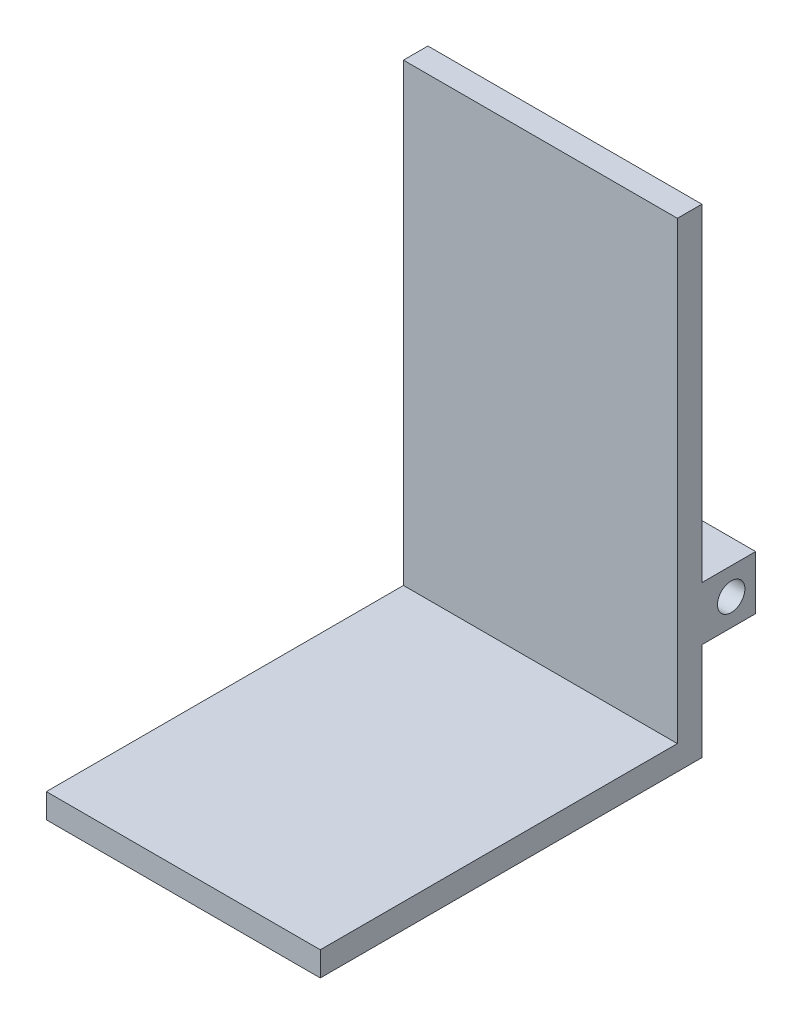
ISO-10303-21;
HEADER;
FILE_DESCRIPTION(('STEP AP214'),'2;1');
FILE_NAME('part.step','',(''),(''),'','','');
FILE_SCHEMA(('AUTOMOTIVE_DESIGN { 1 0 10303 214 1 1 1 1 }'));
ENDSEC;
DATA;
#1=APPLICATION_CONTEXT('core data for automotive mechanical design processes');
#2=APPLICATION_PROTOCOL_DEFINITION('international standard','automotive_design',2000,#1);
#3=PRODUCT_CONTEXT('',#1,'mechanical');
#4=PRODUCT('Part','Part','',(#3));
#5=PRODUCT_RELATED_PRODUCT_CATEGORY('part','',(#4));
#6=PRODUCT_DEFINITION_FORMATION('','',#4);
#7=PRODUCT_DEFINITION_CONTEXT('part definition',#1,'design');
#8=PRODUCT_DEFINITION('design','',#6,#7);
#9=PRODUCT_DEFINITION_SHAPE('','',#8);
#10=(LENGTH_UNIT() NAMED_UNIT(*) SI_UNIT(.MILLI.,.METRE.));
#11=(NAMED_UNIT(*) PLANE_ANGLE_UNIT() SI_UNIT($,.RADIAN.));
#12=(NAMED_UNIT(*) SI_UNIT($,.STERADIAN.) SOLID_ANGLE_UNIT());
#13=UNCERTAINTY_MEASURE_WITH_UNIT(LENGTH_MEASURE(1.E-05),#10,'distance_accuracy_value','');
#14=(GEOMETRIC_REPRESENTATION_CONTEXT(3) GLOBAL_UNCERTAINTY_ASSIGNED_CONTEXT((#13)) GLOBAL_UNIT_ASSIGNED_CONTEXT((#10,
#11,#12)) REPRESENTATION_CONTEXT('',''));
#15=CARTESIAN_POINT('',(0.,0.,0.));
#16=DIRECTION('',(0.,0.,1.));
#17=DIRECTION('',(1.,0.,0.));
#18=AXIS2_PLACEMENT_3D('',#15,#16,#17);
#19=CARTESIAN_POINT('',(-14.,2.5,-19.5));
#20=DIRECTION('',(0.,0.,1.));
#21=DIRECTION('',(1.,0.,0.));
#22=AXIS2_PLACEMENT_3D('',#19,#20,#21);
#23=PLANE('',#22);
#24=DIRECTION('',(1.,0.,0.));
#25=VECTOR('',#24,1.);
#26=CARTESIAN_POINT('',(-21.778174593052,15.5,-19.5));
#27=LINE('',#26,#25);
#28=CARTESIAN_POINT('',(-14.,15.5,-19.5));
#29=VERTEX_POINT('',#28);
#30=CARTESIAN_POINT('',(14.,15.5,-19.5));
#31=VERTEX_POINT('',#30);
#32=EDGE_CURVE('E194',#29,#31,#27,.T.);
#33=ORIENTED_EDGE('',*,*,#32,.F.);
#34=DIRECTION('',(0.,-1.,0.));
#35=VECTOR('',#34,1.);
#36=CARTESIAN_POINT('',(-14.,2.5,-19.5));
#37=LINE('',#36,#35);
#38=CARTESIAN_POINT('',(-14.,49.,-19.5));
#39=VERTEX_POINT('',#38);
#40=EDGE_CURVE('E179',#39,#29,#37,.T.);
#41=ORIENTED_EDGE('',*,*,#40,.F.);
#42=DIRECTION('',(-1.,0.,0.));
#43=VECTOR('',#42,1.);
#44=CARTESIAN_POINT('',(-14.,49.,-19.5));
#45=LINE('',#44,#43);
#46=CARTESIAN_POINT('',(14.,49.,-19.5));
#47=VERTEX_POINT('',#46);
#48=EDGE_CURVE('E155',#47,#39,#45,.T.);
#49=ORIENTED_EDGE('',*,*,#48,.F.);
#50=DIRECTION('',(0.,-1.,0.));
#51=VECTOR('',#50,1.);
#52=CARTESIAN_POINT('',(14.,2.5,-19.5));
#53=LINE('',#52,#51);
#54=EDGE_CURVE('E11',#47,#31,#53,.T.);
#55=ORIENTED_EDGE('',*,*,#54,.T.);
#56=EDGE_LOOP('',(#33,#41,#49,#55));
#57=FACE_BOUND('',#56,.T.);
#58=ADVANCED_FACE('F33',(#57),#23,.F.);
#59=CARTESIAN_POINT('',(0.,2.5,0.));
#60=DIRECTION('',(0.,-1.,0.));
#61=DIRECTION('',(0.,0.,-1.));
#62=AXIS2_PLACEMENT_3D('',#59,#60,#61);
#63=PLANE('',#62);
#64=DIRECTION('',(1.,0.,0.));
#65=VECTOR('',#64,1.);
#66=CARTESIAN_POINT('',(-14.,2.5,-17.));
#67=LINE('',#66,#65);
#68=CARTESIAN_POINT('',(-14.,2.5,-17.));
#69=VERTEX_POINT('',#68);
#70=CARTESIAN_POINT('',(14.,2.5,-17.));
#71=VERTEX_POINT('',#70);
#72=EDGE_CURVE('E146',#69,#71,#67,.T.);
#73=ORIENTED_EDGE('',*,*,#72,.F.);
#74=DIRECTION('',(0.,0.,1.));
#75=VECTOR('',#74,1.);
#76=CARTESIAN_POINT('',(-14.,2.5,19.5));
#77=LINE('',#76,#75);
#78=CARTESIAN_POINT('',(-14.,2.5,19.5));
#79=VERTEX_POINT('',#78);
#80=EDGE_CURVE('E167',#69,#79,#77,.T.);
#81=ORIENTED_EDGE('',*,*,#80,.T.);
#82=DIRECTION('',(1.,0.,0.));
#83=VECTOR('',#82,1.);
#84=CARTESIAN_POINT('',(-14.,2.5,19.5));
#85=LINE('',#84,#83);
#86=CARTESIAN_POINT('',(14.,2.5,19.5));
#87=VERTEX_POINT('',#86);
#88=EDGE_CURVE('E229',#79,#87,#85,.T.);
#89=ORIENTED_EDGE('',*,*,#88,.T.);
#90=DIRECTION('',(0.,0.,-1.));
#91=VECTOR('',#90,1.);
#92=CARTESIAN_POINT('',(14.,2.5,19.5));
#93=LINE('',#92,#91);
#94=EDGE_CURVE('E190',#87,#71,#93,.T.);
#95=ORIENTED_EDGE('',*,*,#94,.T.);
#96=EDGE_LOOP('',(#73,#81,#89,#95));
#97=FACE_BOUND('',#96,.T.);
#98=ADVANCED_FACE('F237',(#97),#63,.F.);
#99=CARTESIAN_POINT('',(14.,2.5,19.5));
#100=DIRECTION('',(-1.,0.,0.));
#101=DIRECTION('',(0.,0.,1.));
#102=AXIS2_PLACEMENT_3D('',#99,#100,#101);
#103=PLANE('',#102);
#104=DIRECTION('',(0.,0.,-1.));
#105=VECTOR('',#104,1.);
#106=CARTESIAN_POINT('',(14.,0.,19.5));
#107=LINE('',#106,#105);
#108=CARTESIAN_POINT('',(14.,0.,19.5));
#109=VERTEX_POINT('',#108);
#110=CARTESIAN_POINT('',(14.,0.,-19.5));
#111=VERTEX_POINT('',#110);
#112=EDGE_CURVE('E176',#109,#111,#107,.T.);
#113=ORIENTED_EDGE('',*,*,#112,.T.);
#114=CARTESIAN_POINT('',(14.,10.,-19.5));
#115=VERTEX_POINT('',#114);
#116=EDGE_CURVE('E42',#115,#111,#53,.T.);
#117=ORIENTED_EDGE('',*,*,#116,.F.);
#118=DIRECTION('',(0.,0.,-1.));
#119=VECTOR('',#118,1.);
#120=CARTESIAN_POINT('',(14.,10.,-19.5));
#121=LINE('',#120,#119);
#122=CARTESIAN_POINT('',(14.,10.,-25.));
#123=VERTEX_POINT('',#122);
#124=EDGE_CURVE('E115',#115,#123,#121,.T.);
#125=ORIENTED_EDGE('',*,*,#124,.T.);
#126=DIRECTION('',(0.,1.,0.));
#127=VECTOR('',#126,1.);
#128=CARTESIAN_POINT('',(14.,15.5,-25.));
#129=LINE('',#128,#127);
#130=CARTESIAN_POINT('',(14.,15.5,-25.));
#131=VERTEX_POINT('',#130);
#132=EDGE_CURVE('E122',#123,#131,#129,.T.);
#133=ORIENTED_EDGE('',*,*,#132,.T.);
#134=DIRECTION('',(0.,0.,1.));
#135=VECTOR('',#134,1.);
#136=CARTESIAN_POINT('',(14.,15.5,-19.5));
#137=LINE('',#136,#135);
#138=EDGE_CURVE('E128',#131,#31,#137,.T.);
#139=ORIENTED_EDGE('',*,*,#138,.T.);
#140=ORIENTED_EDGE('',*,*,#54,.F.);
#141=DIRECTION('',(0.,0.,-1.));
#142=VECTOR('',#141,1.);
#143=CARTESIAN_POINT('',(14.,49.,-19.5));
#144=LINE('',#143,#142);
#145=CARTESIAN_POINT('',(14.,49.,-17.));
#146=VERTEX_POINT('',#145);
#147=EDGE_CURVE('E152',#146,#47,#144,.T.);
#148=ORIENTED_EDGE('',*,*,#147,.F.);
#149=DIRECTION('',(0.,-1.,0.));
#150=VECTOR('',#149,1.);
#151=CARTESIAN_POINT('',(14.,49.,-17.));
#152=LINE('',#151,#150);
#153=EDGE_CURVE('E158',#146,#71,#152,.T.);
#154=ORIENTED_EDGE('',*,*,#153,.T.);
#155=ORIENTED_EDGE('',*,*,#94,.F.);
#156=DIRECTION('',(0.,-1.,0.));
#157=VECTOR('',#156,1.);
#158=CARTESIAN_POINT('',(14.,2.5,19.5));
#159=LINE('',#158,#157);
#160=EDGE_CURVE('E227',#87,#109,#159,.T.);
#161=ORIENTED_EDGE('',*,*,#160,.T.);
#162=EDGE_LOOP('',(#113,#117,#125,#133,#139,#140,#148,#154,#155,#161));
#163=FACE_BOUND('',#162,.T.);
#164=CARTESIAN_POINT('',(14.,12.75,-22.5));
#165=DIRECTION('',(1.,0.,0.));
#166=DIRECTION('',(0.,0.,-1.));
#167=AXIS2_PLACEMENT_3D('',#164,#165,#166);
#168=CIRCLE('',#167,1.4);
#169=CARTESIAN_POINT('',(14.,12.75,-23.9));
#170=VERTEX_POINT('',#169);
#171=EDGE_CURVE('E132',#170,#170,#168,.T.);
#172=ORIENTED_EDGE('',*,*,#171,.F.);
#173=EDGE_LOOP('',(#172));
#174=FACE_BOUND('',#173,.T.);
#175=ADVANCED_FACE('F35',(#163,#174),#103,.F.);
#176=CARTESIAN_POINT('',(-14.,10.,-19.5));
#177=VERTEX_POINT('',#176);
#178=CARTESIAN_POINT('',(-14.,0.,-19.5));
#179=VERTEX_POINT('',#178);
#180=EDGE_CURVE('E55',#177,#179,#37,.T.);
#181=ORIENTED_EDGE('',*,*,#180,.F.);
#182=DIRECTION('',(1.,0.,0.));
#183=VECTOR('',#182,1.);
#184=CARTESIAN_POINT('',(-21.778174593052,10.,-19.5));
#185=LINE('',#184,#183);
#186=EDGE_CURVE('E50',#177,#115,#185,.T.);
#187=ORIENTED_EDGE('',*,*,#186,.T.);
#188=ORIENTED_EDGE('',*,*,#116,.T.);
#189=DIRECTION('',(-1.,0.,0.));
#190=VECTOR('',#189,1.);
#191=CARTESIAN_POINT('',(-14.,0.,-19.5));
#192=LINE('',#191,#190);
#193=EDGE_CURVE('E216',#111,#179,#192,.T.);
#194=ORIENTED_EDGE('',*,*,#193,.T.);
#195=EDGE_LOOP('',(#181,#187,#188,#194));
#196=FACE_BOUND('',#195,.T.);
#197=ADVANCED_FACE('F217',(#196),#23,.F.);
#198=CARTESIAN_POINT('',(-14.,2.5,19.5));
#199=DIRECTION('',(1.,0.,0.));
#200=DIRECTION('',(0.,0.,-1.));
#201=AXIS2_PLACEMENT_3D('',#198,#199,#200);
#202=PLANE('',#201);
#203=DIRECTION('',(0.,0.,1.));
#204=VECTOR('',#203,1.);
#205=CARTESIAN_POINT('',(-14.,0.,19.5));
#206=LINE('',#205,#204);
#207=CARTESIAN_POINT('',(-14.,0.,19.5));
#208=VERTEX_POINT('',#207);
#209=EDGE_CURVE('E213',#179,#208,#206,.T.);
#210=ORIENTED_EDGE('',*,*,#209,.T.);
#211=DIRECTION('',(0.,-1.,0.));
#212=VECTOR('',#211,1.);
#213=CARTESIAN_POINT('',(-14.,2.5,19.5));
#214=LINE('',#213,#212);
#215=EDGE_CURVE('E186',#79,#208,#214,.T.);
#216=ORIENTED_EDGE('',*,*,#215,.F.);
#217=ORIENTED_EDGE('',*,*,#80,.F.);
#218=DIRECTION('',(0.,-1.,0.));
#219=VECTOR('',#218,1.);
#220=CARTESIAN_POINT('',(-14.,49.,-17.));
#221=LINE('',#220,#219);
#222=CARTESIAN_POINT('',(-14.,49.,-17.));
#223=VERTEX_POINT('',#222);
#224=EDGE_CURVE('E171',#223,#69,#221,.T.);
#225=ORIENTED_EDGE('',*,*,#224,.F.);
#226=DIRECTION('',(0.,0.,1.));
#227=VECTOR('',#226,1.);
#228=CARTESIAN_POINT('',(-14.,49.,-19.5));
#229=LINE('',#228,#227);
#230=EDGE_CURVE('E147',#39,#223,#229,.T.);
#231=ORIENTED_EDGE('',*,*,#230,.F.);
#232=ORIENTED_EDGE('',*,*,#40,.T.);
#233=DIRECTION('',(0.,0.,-1.));
#234=VECTOR('',#233,1.);
#235=CARTESIAN_POINT('',(-14.,15.5,-19.5));
#236=LINE('',#235,#234);
#237=CARTESIAN_POINT('',(-14.,15.5,-25.));
#238=VERTEX_POINT('',#237);
#239=EDGE_CURVE('E202',#29,#238,#236,.T.);
#240=ORIENTED_EDGE('',*,*,#239,.T.);
#241=DIRECTION('',(0.,-1.,0.));
#242=VECTOR('',#241,1.);
#243=CARTESIAN_POINT('',(-14.,15.5,-25.));
#244=LINE('',#243,#242);
#245=CARTESIAN_POINT('',(-14.,10.,-25.));
#246=VERTEX_POINT('',#245);
#247=EDGE_CURVE('E198',#238,#246,#244,.T.);
#248=ORIENTED_EDGE('',*,*,#247,.T.);
#249=DIRECTION('',(0.,0.,1.));
#250=VECTOR('',#249,1.);
#251=CARTESIAN_POINT('',(-14.,10.,-19.5));
#252=LINE('',#251,#250);
#253=EDGE_CURVE('E116',#246,#177,#252,.T.);
#254=ORIENTED_EDGE('',*,*,#253,.T.);
#255=ORIENTED_EDGE('',*,*,#180,.T.);
#256=EDGE_LOOP('',(#210,#216,#217,#225,#231,#232,#240,#248,#254,#255));
#257=FACE_BOUND('',#256,.T.);
#258=CARTESIAN_POINT('',(-14.,12.75,-22.5));
#259=DIRECTION('',(1.,0.,0.));
#260=DIRECTION('',(0.,0.,-1.));
#261=AXIS2_PLACEMENT_3D('',#258,#259,#260);
#262=CIRCLE('',#261,1.4);
#263=CARTESIAN_POINT('',(-14.,12.75,-23.9));
#264=VERTEX_POINT('',#263);
#265=EDGE_CURVE('E143',#264,#264,#262,.F.);
#266=ORIENTED_EDGE('',*,*,#265,.F.);
#267=EDGE_LOOP('',(#266));
#268=FACE_BOUND('',#267,.T.);
#269=ADVANCED_FACE('F209',(#257,#268),#202,.F.);
#270=CARTESIAN_POINT('',(-14.,2.5,19.5));
#271=DIRECTION('',(0.,0.,-1.));
#272=DIRECTION('',(-1.,0.,0.));
#273=AXIS2_PLACEMENT_3D('',#270,#271,#272);
#274=PLANE('',#273);
#275=DIRECTION('',(1.,0.,0.));
#276=VECTOR('',#275,1.);
#277=CARTESIAN_POINT('',(-14.,0.,19.5));
#278=LINE('',#277,#276);
#279=EDGE_CURVE('E223',#208,#109,#278,.T.);
#280=ORIENTED_EDGE('',*,*,#279,.T.);
#281=ORIENTED_EDGE('',*,*,#160,.F.);
#282=ORIENTED_EDGE('',*,*,#88,.F.);
#283=ORIENTED_EDGE('',*,*,#215,.T.);
#284=EDGE_LOOP('',(#280,#281,#282,#283));
#285=FACE_BOUND('',#284,.T.);
#286=ADVANCED_FACE('F271',(#285),#274,.F.);
#287=CARTESIAN_POINT('',(0.,0.,0.));
#288=DIRECTION('',(0.,-1.,0.));
#289=DIRECTION('',(0.,0.,-1.));
#290=AXIS2_PLACEMENT_3D('',#287,#288,#289);
#291=PLANE('',#290);
#292=ORIENTED_EDGE('',*,*,#112,.F.);
#293=ORIENTED_EDGE('',*,*,#279,.F.);
#294=ORIENTED_EDGE('',*,*,#209,.F.);
#295=ORIENTED_EDGE('',*,*,#193,.F.);
#296=EDGE_LOOP('',(#292,#293,#294,#295));
#297=FACE_BOUND('',#296,.T.);
#298=ADVANCED_FACE('F222',(#297),#291,.T.);
#299=CARTESIAN_POINT('',(-14.,49.,-17.));
#300=DIRECTION('',(0.,0.,-1.));
#301=DIRECTION('',(-1.,0.,0.));
#302=AXIS2_PLACEMENT_3D('',#299,#300,#301);
#303=PLANE('',#302);
#304=ORIENTED_EDGE('',*,*,#72,.T.);
#305=ORIENTED_EDGE('',*,*,#153,.F.);
#306=DIRECTION('',(1.,0.,0.));
#307=VECTOR('',#306,1.);
#308=CARTESIAN_POINT('',(-14.,49.,-17.));
#309=LINE('',#308,#307);
#310=EDGE_CURVE('E150',#223,#146,#309,.T.);
#311=ORIENTED_EDGE('',*,*,#310,.F.);
#312=ORIENTED_EDGE('',*,*,#224,.T.);
#313=EDGE_LOOP('',(#304,#305,#311,#312));
#314=FACE_BOUND('',#313,.T.);
#315=ADVANCED_FACE('F240',(#314),#303,.F.);
#316=CARTESIAN_POINT('',(0.,49.,0.));
#317=DIRECTION('',(0.,1.,0.));
#318=DIRECTION('',(0.,0.,1.));
#319=AXIS2_PLACEMENT_3D('',#316,#317,#318);
#320=PLANE('',#319);
#321=ORIENTED_EDGE('',*,*,#230,.T.);
#322=ORIENTED_EDGE('',*,*,#310,.T.);
#323=ORIENTED_EDGE('',*,*,#147,.T.);
#324=ORIENTED_EDGE('',*,*,#48,.T.);
#325=EDGE_LOOP('',(#321,#322,#323,#324));
#326=FACE_BOUND('',#325,.T.);
#327=ADVANCED_FACE('F245',(#326),#320,.T.);
#328=CARTESIAN_POINT('',(-21.778174593052,10.,-19.5));
#329=DIRECTION('',(0.,-1.,0.));
#330=DIRECTION('',(0.,0.,-1.));
#331=AXIS2_PLACEMENT_3D('',#328,#329,#330);
#332=PLANE('',#331);
#333=ORIENTED_EDGE('',*,*,#253,.F.);
#334=DIRECTION('',(1.,0.,0.));
#335=VECTOR('',#334,1.);
#336=CARTESIAN_POINT('',(-21.778174593052,10.,-25.));
#337=LINE('',#336,#335);
#338=EDGE_CURVE('E111',#246,#123,#337,.T.);
#339=ORIENTED_EDGE('',*,*,#338,.T.);
#340=ORIENTED_EDGE('',*,*,#124,.F.);
#341=ORIENTED_EDGE('',*,*,#186,.F.);
#342=EDGE_LOOP('',(#333,#339,#340,#341));
#343=FACE_BOUND('',#342,.T.);
#344=ADVANCED_FACE('F113',(#343),#332,.T.);
#345=CARTESIAN_POINT('',(-21.778174593052,15.5,-25.));
#346=DIRECTION('',(0.,0.,-1.));
#347=DIRECTION('',(0.,1.,0.));
#348=AXIS2_PLACEMENT_3D('',#345,#346,#347);
#349=PLANE('',#348);
#350=ORIENTED_EDGE('',*,*,#247,.F.);
#351=DIRECTION('',(1.,0.,0.));
#352=VECTOR('',#351,1.);
#353=CARTESIAN_POINT('',(-21.778174593052,15.5,-25.));
#354=LINE('',#353,#352);
#355=EDGE_CURVE('E119',#238,#131,#354,.T.);
#356=ORIENTED_EDGE('',*,*,#355,.T.);
#357=ORIENTED_EDGE('',*,*,#132,.F.);
#358=ORIENTED_EDGE('',*,*,#338,.F.);
#359=EDGE_LOOP('',(#350,#356,#357,#358));
#360=FACE_BOUND('',#359,.T.);
#361=ADVANCED_FACE('F123',(#360),#349,.T.);
#362=CARTESIAN_POINT('',(-21.778174593052,15.5,-19.5));
#363=DIRECTION('',(0.,1.,0.));
#364=DIRECTION('',(0.,0.,1.));
#365=AXIS2_PLACEMENT_3D('',#362,#363,#364);
#366=PLANE('',#365);
#367=ORIENTED_EDGE('',*,*,#239,.F.);
#368=ORIENTED_EDGE('',*,*,#32,.T.);
#369=ORIENTED_EDGE('',*,*,#138,.F.);
#370=ORIENTED_EDGE('',*,*,#355,.F.);
#371=EDGE_LOOP('',(#367,#368,#369,#370));
#372=FACE_BOUND('',#371,.T.);
#373=ADVANCED_FACE('F249',(#372),#366,.T.);
#374=CARTESIAN_POINT('',(-21.778174593052,12.75,-22.5));
#375=DIRECTION('',(1.,0.,0.));
#376=DIRECTION('',(0.,0.,-1.));
#377=AXIS2_PLACEMENT_3D('',#374,#375,#376);
#378=CYLINDRICAL_SURFACE('',#377,1.4);
#379=ORIENTED_EDGE('',*,*,#265,.T.);
#380=EDGE_LOOP('',(#379));
#381=FACE_BOUND('',#380,.T.);
#382=ORIENTED_EDGE('',*,*,#171,.T.);
#383=EDGE_LOOP('',(#382));
#384=FACE_BOUND('',#383,.T.);
#385=ADVANCED_FACE('F251',(#381,#384),#378,.F.);
#386=CLOSED_SHELL('',(#58,#98,#175,#197,#269,#286,#298,#315,#327,#344,#361,#373,#385));
#387=MANIFOLD_SOLID_BREP('B2',#386);
#388=ADVANCED_BREP_SHAPE_REPRESENTATION('',(#18,#387),#14);
#389=SHAPE_DEFINITION_REPRESENTATION(#9,#388);
ENDSEC;
END-ISO-10303-21;
